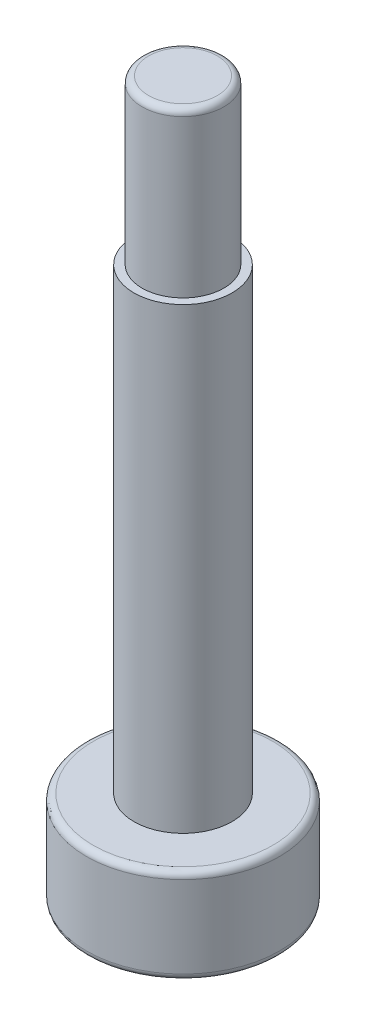
ISO-10303-21;
HEADER;
FILE_DESCRIPTION(('STEP AP214'),'2;1');
FILE_NAME('part.step','',(''),(''),'','','');
FILE_SCHEMA(('AUTOMOTIVE_DESIGN { 1 0 10303 214 1 1 1 1 }'));
ENDSEC;
DATA;
#1=APPLICATION_CONTEXT('core data for automotive mechanical design processes');
#2=APPLICATION_PROTOCOL_DEFINITION('international standard','automotive_design',2000,#1);
#3=PRODUCT_CONTEXT('',#1,'mechanical');
#4=PRODUCT('Part','Part','',(#3));
#5=PRODUCT_RELATED_PRODUCT_CATEGORY('part','',(#4));
#6=PRODUCT_DEFINITION_FORMATION('','',#4);
#7=PRODUCT_DEFINITION_CONTEXT('part definition',#1,'design');
#8=PRODUCT_DEFINITION('design','',#6,#7);
#9=PRODUCT_DEFINITION_SHAPE('','',#8);
#10=(LENGTH_UNIT() NAMED_UNIT(*) SI_UNIT(.MILLI.,.METRE.));
#11=(NAMED_UNIT(*) PLANE_ANGLE_UNIT() SI_UNIT($,.RADIAN.));
#12=(NAMED_UNIT(*) SI_UNIT($,.STERADIAN.) SOLID_ANGLE_UNIT());
#13=UNCERTAINTY_MEASURE_WITH_UNIT(LENGTH_MEASURE(1.E-05),#10,'distance_accuracy_value','');
#14=(GEOMETRIC_REPRESENTATION_CONTEXT(3) GLOBAL_UNCERTAINTY_ASSIGNED_CONTEXT((#13)) GLOBAL_UNIT_ASSIGNED_CONTEXT((#10,
#11,#12)) REPRESENTATION_CONTEXT('',''));
#15=CARTESIAN_POINT('',(0.,0.,0.));
#16=DIRECTION('',(0.,0.,1.));
#17=DIRECTION('',(1.,0.,0.));
#18=AXIS2_PLACEMENT_3D('',#15,#16,#17);
#19=CARTESIAN_POINT('',(0.,2.9,0.));
#20=DIRECTION('',(0.,-1.,0.));
#21=DIRECTION('',(0.,0.,-1.));
#22=AXIS2_PLACEMENT_3D('',#19,#20,#21);
#23=CYLINDRICAL_SURFACE('',#22,2.95);
#24=CARTESIAN_POINT('',(0.,0.2,0.));
#25=DIRECTION('',(0.,1.,0.));
#26=DIRECTION('',(0.,0.,1.));
#27=AXIS2_PLACEMENT_3D('',#24,#25,#26);
#28=CIRCLE('',#27,2.95);
#29=CARTESIAN_POINT('',(0.,0.2,2.95));
#30=VERTEX_POINT('',#29);
#31=EDGE_CURVE('E179',#30,#30,#28,.T.);
#32=ORIENTED_EDGE('',*,*,#31,.T.);
#33=EDGE_LOOP('',(#32));
#34=FACE_BOUND('',#33,.T.);
#35=CARTESIAN_POINT('',(0.,2.7,0.));
#36=DIRECTION('',(0.,1.,0.));
#37=DIRECTION('',(0.,0.,1.));
#38=AXIS2_PLACEMENT_3D('',#35,#36,#37);
#39=CIRCLE('',#38,2.95);
#40=CARTESIAN_POINT('',(0.,2.7,2.95));
#41=VERTEX_POINT('',#40);
#42=EDGE_CURVE('E168',#41,#41,#39,.F.);
#43=ORIENTED_EDGE('',*,*,#42,.T.);
#44=EDGE_LOOP('',(#43));
#45=FACE_BOUND('',#44,.T.);
#46=ADVANCED_FACE('F39',(#34,#45),#23,.T.);
#47=CARTESIAN_POINT('',(0.,2.9,0.));
#48=DIRECTION('',(0.,1.,0.));
#49=DIRECTION('',(0.,0.,1.));
#50=AXIS2_PLACEMENT_3D('',#47,#48,#49);
#51=PLANE('',#50);
#52=CARTESIAN_POINT('',(0.,2.9,0.));
#53=DIRECTION('',(0.,1.,0.));
#54=DIRECTION('',(0.,0.,1.));
#55=AXIS2_PLACEMENT_3D('',#52,#53,#54);
#56=CIRCLE('',#55,2.75);
#57=CARTESIAN_POINT('',(0.,2.9,2.75));
#58=VERTEX_POINT('',#57);
#59=EDGE_CURVE('E187',#58,#58,#56,.T.);
#60=ORIENTED_EDGE('',*,*,#59,.T.);
#61=EDGE_LOOP('',(#60));
#62=FACE_BOUND('',#61,.T.);
#63=CARTESIAN_POINT('',(0.,2.9,0.));
#64=DIRECTION('',(0.,1.,0.));
#65=DIRECTION('',(0.,0.,1.));
#66=AXIS2_PLACEMENT_3D('',#63,#64,#65);
#67=CIRCLE('',#66,1.5);
#68=CARTESIAN_POINT('',(0.,2.9,1.5));
#69=VERTEX_POINT('',#68);
#70=EDGE_CURVE('E169',#69,#69,#67,.T.);
#71=ORIENTED_EDGE('',*,*,#70,.F.);
#72=EDGE_LOOP('',(#71));
#73=FACE_BOUND('',#72,.T.);
#74=ADVANCED_FACE('F206',(#62,#73),#51,.T.);
#75=CARTESIAN_POINT('',(0.,0.,0.));
#76=DIRECTION('',(0.,1.,0.));
#77=DIRECTION('',(0.,0.,1.));
#78=AXIS2_PLACEMENT_3D('',#75,#76,#77);
#79=PLANE('',#78);
#80=CARTESIAN_POINT('',(0.,0.,0.));
#81=DIRECTION('',(0.,1.,0.));
#82=DIRECTION('',(0.,0.,1.));
#83=AXIS2_PLACEMENT_3D('',#80,#81,#82);
#84=CIRCLE('',#83,2.75);
#85=CARTESIAN_POINT('',(0.,0.,2.75));
#86=VERTEX_POINT('',#85);
#87=EDGE_CURVE('E183',#86,#86,#84,.F.);
#88=ORIENTED_EDGE('',*,*,#87,.T.);
#89=EDGE_LOOP('',(#88));
#90=FACE_BOUND('',#89,.T.);
#91=DIRECTION('',(-0.28704549437819,0.,0.95791695055322));
#92=VECTOR('',#91,1.);
#93=CARTESIAN_POINT('',(2.24728548800427,0.,-0.532016229770034));
#94=LINE('',#93,#92);
#95=CARTESIAN_POINT('',(2.24728548800427,0.,-0.532016229770034));
#96=VERTEX_POINT('',#95);
#97=CARTESIAN_POINT('',(1.58438231420861,0.,1.68019820728279));
#98=VERTEX_POINT('',#97);
#99=EDGE_CURVE('E135',#96,#98,#94,.T.);
#100=ORIENTED_EDGE('',*,*,#99,.F.);
#101=DIRECTION('',(0.686057666705715,0.,0.727547165449986));
#102=VECTOR('',#101,1.);
#103=CARTESIAN_POINT('',(0.662903173795668,0.,-2.21221443705283));
#104=LINE('',#103,#102);
#105=CARTESIAN_POINT('',(0.662903173795668,0.,-2.21221443705283));
#106=VERTEX_POINT('',#105);
#107=EDGE_CURVE('E55',#106,#96,#104,.T.);
#108=ORIENTED_EDGE('',*,*,#107,.F.);
#109=DIRECTION('',(0.973103161083906,0.,-0.230369785103234));
#110=VECTOR('',#109,1.);
#111=CARTESIAN_POINT('',(-1.58438231420861,0.,-1.68019820728279));
#112=LINE('',#111,#110);
#113=CARTESIAN_POINT('',(-1.58438231420861,0.,-1.68019820728279));
#114=VERTEX_POINT('',#113);
#115=EDGE_CURVE('E148',#114,#106,#112,.T.);
#116=ORIENTED_EDGE('',*,*,#115,.F.);
#117=DIRECTION('',(0.28704549437819,0.,-0.95791695055322));
#118=VECTOR('',#117,1.);
#119=CARTESIAN_POINT('',(-2.24728548800427,0.,0.532016229770034));
#120=LINE('',#119,#118);
#121=CARTESIAN_POINT('',(-2.24728548800427,0.,0.532016229770034));
#122=VERTEX_POINT('',#121);
#123=EDGE_CURVE('E145',#122,#114,#120,.T.);
#124=ORIENTED_EDGE('',*,*,#123,.F.);
#125=DIRECTION('',(-0.686057666705716,0.,-0.727547165449986));
#126=VECTOR('',#125,1.);
#127=CARTESIAN_POINT('',(-0.662903173795669,0.,2.21221443705283));
#128=LINE('',#127,#126);
#129=CARTESIAN_POINT('',(-0.662903173795669,0.,2.21221443705283));
#130=VERTEX_POINT('',#129);
#131=EDGE_CURVE('E103',#130,#122,#128,.T.);
#132=ORIENTED_EDGE('',*,*,#131,.F.);
#133=DIRECTION('',(-0.973103161083906,0.,0.230369785103234));
#134=VECTOR('',#133,1.);
#135=CARTESIAN_POINT('',(1.58438231420861,0.,1.68019820728279));
#136=LINE('',#135,#134);
#137=EDGE_CURVE('E139',#98,#130,#136,.T.);
#138=ORIENTED_EDGE('',*,*,#137,.F.);
#139=EDGE_LOOP('',(#100,#108,#116,#124,#132,#138));
#140=FACE_BOUND('',#139,.T.);
#141=ADVANCED_FACE('F212',(#90,#140),#79,.F.);
#142=CARTESIAN_POINT('',(0.,16.9,0.));
#143=DIRECTION('',(0.,-1.,0.));
#144=DIRECTION('',(0.,0.,-1.));
#145=AXIS2_PLACEMENT_3D('',#142,#143,#144);
#146=CYLINDRICAL_SURFACE('',#145,1.5);
#147=CARTESIAN_POINT('',(0.,16.9,0.));
#148=DIRECTION('',(0.,1.,0.));
#149=DIRECTION('',(0.,0.,1.));
#150=AXIS2_PLACEMENT_3D('',#147,#148,#149);
#151=CIRCLE('',#150,1.5);
#152=CARTESIAN_POINT('',(0.,16.9,1.5));
#153=VERTEX_POINT('',#152);
#154=EDGE_CURVE('E154',#153,#153,#151,.T.);
#155=ORIENTED_EDGE('',*,*,#154,.F.);
#156=EDGE_LOOP('',(#155));
#157=FACE_BOUND('',#156,.T.);
#158=ORIENTED_EDGE('',*,*,#70,.T.);
#159=EDGE_LOOP('',(#158));
#160=FACE_BOUND('',#159,.T.);
#161=ADVANCED_FACE('F231',(#157,#160),#146,.T.);
#162=CARTESIAN_POINT('',(0.,16.9,0.));
#163=DIRECTION('',(0.,1.,0.));
#164=DIRECTION('',(0.,0.,1.));
#165=AXIS2_PLACEMENT_3D('',#162,#163,#164);
#166=PLANE('',#165);
#167=CARTESIAN_POINT('',(0.,16.9,0.));
#168=DIRECTION('',(0.,1.,0.));
#169=DIRECTION('',(0.,0.,1.));
#170=AXIS2_PLACEMENT_3D('',#167,#168,#169);
#171=CIRCLE('',#170,1.25);
#172=CARTESIAN_POINT('',(0.,16.9,1.25));
#173=VERTEX_POINT('',#172);
#174=EDGE_CURVE('E164',#173,#173,#171,.T.);
#175=ORIENTED_EDGE('',*,*,#174,.F.);
#176=EDGE_LOOP('',(#175));
#177=FACE_BOUND('',#176,.T.);
#178=ORIENTED_EDGE('',*,*,#154,.T.);
#179=EDGE_LOOP('',(#178));
#180=FACE_BOUND('',#179,.T.);
#181=ADVANCED_FACE('F255',(#177,#180),#166,.T.);
#182=CARTESIAN_POINT('',(0.,21.9,0.));
#183=DIRECTION('',(0.,-1.,0.));
#184=DIRECTION('',(0.,0.,-1.));
#185=AXIS2_PLACEMENT_3D('',#182,#183,#184);
#186=CYLINDRICAL_SURFACE('',#185,1.25);
#187=CARTESIAN_POINT('',(0.,21.7,0.));
#188=DIRECTION('',(0.,1.,0.));
#189=DIRECTION('',(0.,0.,1.));
#190=AXIS2_PLACEMENT_3D('',#187,#188,#189);
#191=CIRCLE('',#190,1.25);
#192=CARTESIAN_POINT('',(0.,21.7,1.25));
#193=VERTEX_POINT('',#192);
#194=EDGE_CURVE('E11',#193,#193,#191,.F.);
#195=ORIENTED_EDGE('',*,*,#194,.T.);
#196=EDGE_LOOP('',(#195));
#197=FACE_BOUND('',#196,.T.);
#198=ORIENTED_EDGE('',*,*,#174,.T.);
#199=EDGE_LOOP('',(#198));
#200=FACE_BOUND('',#199,.T.);
#201=ADVANCED_FACE('F248',(#197,#200),#186,.T.);
#202=CARTESIAN_POINT('',(0.,21.9,0.));
#203=DIRECTION('',(0.,1.,0.));
#204=DIRECTION('',(0.,0.,1.));
#205=AXIS2_PLACEMENT_3D('',#202,#203,#204);
#206=PLANE('',#205);
#207=CARTESIAN_POINT('',(0.,21.9,0.));
#208=DIRECTION('',(0.,1.,0.));
#209=DIRECTION('',(0.,0.,1.));
#210=AXIS2_PLACEMENT_3D('',#207,#208,#209);
#211=CIRCLE('',#210,1.05);
#212=CARTESIAN_POINT('',(0.,21.9,1.05));
#213=VERTEX_POINT('',#212);
#214=EDGE_CURVE('E48',#213,#213,#211,.T.);
#215=ORIENTED_EDGE('',*,*,#214,.T.);
#216=EDGE_LOOP('',(#215));
#217=FACE_BOUND('',#216,.T.);
#218=ADVANCED_FACE('F194',(#217),#206,.T.);
#219=CARTESIAN_POINT('',(0.662903173795668,2.,-2.21221443705283));
#220=DIRECTION('',(0.727547165449986,0.,-0.686057666705715));
#221=DIRECTION('',(-0.686057666705716,0.,-0.727547165449986));
#222=AXIS2_PLACEMENT_3D('',#219,#220,#221);
#223=PLANE('',#222);
#224=ORIENTED_EDGE('',*,*,#107,.T.);
#225=DIRECTION('',(0.,-1.,0.));
#226=VECTOR('',#225,1.);
#227=CARTESIAN_POINT('',(2.24728548800427,2.,-0.532016229770034));
#228=LINE('',#227,#226);
#229=CARTESIAN_POINT('',(2.24728548800427,2.,-0.532016229770034));
#230=VERTEX_POINT('',#229);
#231=EDGE_CURVE('E85',#230,#96,#228,.T.);
#232=ORIENTED_EDGE('',*,*,#231,.F.);
#233=DIRECTION('',(0.686057666705715,0.,0.727547165449986));
#234=VECTOR('',#233,1.);
#235=CARTESIAN_POINT('',(0.662903173795668,2.,-2.21221443705283));
#236=LINE('',#235,#234);
#237=CARTESIAN_POINT('',(0.662903173795668,2.,-2.21221443705283));
#238=VERTEX_POINT('',#237);
#239=EDGE_CURVE('E151',#238,#230,#236,.T.);
#240=ORIENTED_EDGE('',*,*,#239,.F.);
#241=DIRECTION('',(0.,-1.,0.));
#242=VECTOR('',#241,1.);
#243=CARTESIAN_POINT('',(0.662903173795668,2.,-2.21221443705283));
#244=LINE('',#243,#242);
#245=EDGE_CURVE('E63',#238,#106,#244,.T.);
#246=ORIENTED_EDGE('',*,*,#245,.T.);
#247=EDGE_LOOP('',(#224,#232,#240,#246));
#248=FACE_BOUND('',#247,.T.);
#249=ADVANCED_FACE('F239',(#248),#223,.F.);
#250=CARTESIAN_POINT('',(-1.58438231420861,2.,-1.68019820728279));
#251=DIRECTION('',(-0.230369785103234,0.,-0.973103161083906));
#252=DIRECTION('',(-0.973103161083906,0.,0.230369785103234));
#253=AXIS2_PLACEMENT_3D('',#250,#251,#252);
#254=PLANE('',#253);
#255=ORIENTED_EDGE('',*,*,#115,.T.);
#256=ORIENTED_EDGE('',*,*,#245,.F.);
#257=DIRECTION('',(0.973103161083906,0.,-0.230369785103234));
#258=VECTOR('',#257,1.);
#259=CARTESIAN_POINT('',(-1.58438231420861,2.,-1.68019820728279));
#260=LINE('',#259,#258);
#261=CARTESIAN_POINT('',(-1.58438231420861,2.,-1.68019820728279));
#262=VERTEX_POINT('',#261);
#263=EDGE_CURVE('E117',#262,#238,#260,.T.);
#264=ORIENTED_EDGE('',*,*,#263,.F.);
#265=DIRECTION('',(0.,-1.,0.));
#266=VECTOR('',#265,1.);
#267=CARTESIAN_POINT('',(-1.58438231420861,2.,-1.68019820728279));
#268=LINE('',#267,#266);
#269=EDGE_CURVE('E108',#262,#114,#268,.T.);
#270=ORIENTED_EDGE('',*,*,#269,.T.);
#271=EDGE_LOOP('',(#255,#256,#264,#270));
#272=FACE_BOUND('',#271,.T.);
#273=ADVANCED_FACE('F241',(#272),#254,.F.);
#274=CARTESIAN_POINT('',(-2.24728548800427,2.,0.532016229770034));
#275=DIRECTION('',(-0.95791695055322,0.,-0.28704549437819));
#276=DIRECTION('',(-0.28704549437819,0.,0.95791695055322));
#277=AXIS2_PLACEMENT_3D('',#274,#275,#276);
#278=PLANE('',#277);
#279=ORIENTED_EDGE('',*,*,#123,.T.);
#280=ORIENTED_EDGE('',*,*,#269,.F.);
#281=DIRECTION('',(0.28704549437819,0.,-0.95791695055322));
#282=VECTOR('',#281,1.);
#283=CARTESIAN_POINT('',(-2.24728548800427,2.,0.532016229770034));
#284=LINE('',#283,#282);
#285=CARTESIAN_POINT('',(-2.24728548800427,2.,0.532016229770034));
#286=VERTEX_POINT('',#285);
#287=EDGE_CURVE('E112',#286,#262,#284,.T.);
#288=ORIENTED_EDGE('',*,*,#287,.F.);
#289=DIRECTION('',(0.,-1.,0.));
#290=VECTOR('',#289,1.);
#291=CARTESIAN_POINT('',(-2.24728548800427,2.,0.532016229770034));
#292=LINE('',#291,#290);
#293=EDGE_CURVE('E96',#286,#122,#292,.T.);
#294=ORIENTED_EDGE('',*,*,#293,.T.);
#295=EDGE_LOOP('',(#279,#280,#288,#294));
#296=FACE_BOUND('',#295,.T.);
#297=ADVANCED_FACE('F113',(#296),#278,.F.);
#298=CARTESIAN_POINT('',(-0.662903173795669,2.,2.21221443705283));
#299=DIRECTION('',(-0.727547165449986,0.,0.686057666705716));
#300=DIRECTION('',(0.686057666705716,0.,0.727547165449986));
#301=AXIS2_PLACEMENT_3D('',#298,#299,#300);
#302=PLANE('',#301);
#303=ORIENTED_EDGE('',*,*,#131,.T.);
#304=ORIENTED_EDGE('',*,*,#293,.F.);
#305=DIRECTION('',(-0.686057666705716,0.,-0.727547165449986));
#306=VECTOR('',#305,1.);
#307=CARTESIAN_POINT('',(-0.662903173795669,2.,2.21221443705283));
#308=LINE('',#307,#306);
#309=CARTESIAN_POINT('',(-0.662903173795669,2.,2.21221443705283));
#310=VERTEX_POINT('',#309);
#311=EDGE_CURVE('E100',#310,#286,#308,.T.);
#312=ORIENTED_EDGE('',*,*,#311,.F.);
#313=DIRECTION('',(0.,-1.,0.));
#314=VECTOR('',#313,1.);
#315=CARTESIAN_POINT('',(-0.662903173795669,2.,2.21221443705283));
#316=LINE('',#315,#314);
#317=EDGE_CURVE('E109',#310,#130,#316,.T.);
#318=ORIENTED_EDGE('',*,*,#317,.T.);
#319=EDGE_LOOP('',(#303,#304,#312,#318));
#320=FACE_BOUND('',#319,.T.);
#321=ADVANCED_FACE('F98',(#320),#302,.F.);
#322=CARTESIAN_POINT('',(1.58438231420861,2.,1.68019820728279));
#323=DIRECTION('',(0.230369785103234,0.,0.973103161083906));
#324=DIRECTION('',(0.973103161083906,0.,-0.230369785103234));
#325=AXIS2_PLACEMENT_3D('',#322,#323,#324);
#326=PLANE('',#325);
#327=ORIENTED_EDGE('',*,*,#137,.T.);
#328=ORIENTED_EDGE('',*,*,#317,.F.);
#329=DIRECTION('',(-0.973103161083906,0.,0.230369785103234));
#330=VECTOR('',#329,1.);
#331=CARTESIAN_POINT('',(1.58438231420861,2.,1.68019820728279));
#332=LINE('',#331,#330);
#333=CARTESIAN_POINT('',(1.58438231420861,2.,1.68019820728279));
#334=VERTEX_POINT('',#333);
#335=EDGE_CURVE('E123',#334,#310,#332,.T.);
#336=ORIENTED_EDGE('',*,*,#335,.F.);
#337=DIRECTION('',(0.,-1.,0.));
#338=VECTOR('',#337,1.);
#339=CARTESIAN_POINT('',(1.58438231420861,2.,1.68019820728279));
#340=LINE('',#339,#338);
#341=EDGE_CURVE('E159',#334,#98,#340,.T.);
#342=ORIENTED_EDGE('',*,*,#341,.T.);
#343=EDGE_LOOP('',(#327,#328,#336,#342));
#344=FACE_BOUND('',#343,.T.);
#345=ADVANCED_FACE('F313',(#344),#326,.F.);
#346=CARTESIAN_POINT('',(2.24728548800427,2.,-0.532016229770034));
#347=DIRECTION('',(0.95791695055322,0.,0.28704549437819));
#348=DIRECTION('',(0.28704549437819,0.,-0.95791695055322));
#349=AXIS2_PLACEMENT_3D('',#346,#347,#348);
#350=PLANE('',#349);
#351=ORIENTED_EDGE('',*,*,#99,.T.);
#352=ORIENTED_EDGE('',*,*,#341,.F.);
#353=DIRECTION('',(-0.28704549437819,0.,0.95791695055322));
#354=VECTOR('',#353,1.);
#355=CARTESIAN_POINT('',(2.24728548800427,2.,-0.532016229770034));
#356=LINE('',#355,#354);
#357=EDGE_CURVE('E127',#230,#334,#356,.T.);
#358=ORIENTED_EDGE('',*,*,#357,.F.);
#359=ORIENTED_EDGE('',*,*,#231,.T.);
#360=EDGE_LOOP('',(#351,#352,#358,#359));
#361=FACE_BOUND('',#360,.T.);
#362=ADVANCED_FACE('F223',(#361),#350,.F.);
#363=CARTESIAN_POINT('',(0.,2.,0.));
#364=DIRECTION('',(0.,-1.,0.));
#365=DIRECTION('',(0.,0.,-1.));
#366=AXIS2_PLACEMENT_3D('',#363,#364,#365);
#367=PLANE('',#366);
#368=ORIENTED_EDGE('',*,*,#239,.T.);
#369=ORIENTED_EDGE('',*,*,#357,.T.);
#370=ORIENTED_EDGE('',*,*,#335,.T.);
#371=ORIENTED_EDGE('',*,*,#311,.T.);
#372=ORIENTED_EDGE('',*,*,#287,.T.);
#373=ORIENTED_EDGE('',*,*,#263,.T.);
#374=EDGE_LOOP('',(#368,#369,#370,#371,#372,#373));
#375=FACE_BOUND('',#374,.T.);
#376=ADVANCED_FACE('F120',(#375),#367,.T.);
#377=CARTESIAN_POINT('',(0.,0.2,0.));
#378=DIRECTION('',(0.,1.,0.));
#379=DIRECTION('',(0.,0.,1.));
#380=AXIS2_PLACEMENT_3D('',#377,#378,#379);
#381=TOROIDAL_SURFACE('',#380,2.75,0.2);
#382=ORIENTED_EDGE('',*,*,#87,.F.);
#383=EDGE_LOOP('',(#382));
#384=FACE_BOUND('',#383,.T.);
#385=ORIENTED_EDGE('',*,*,#31,.F.);
#386=EDGE_LOOP('',(#385));
#387=FACE_BOUND('',#386,.T.);
#388=ADVANCED_FACE('F202',(#384,#387),#381,.T.);
#389=CARTESIAN_POINT('',(0.,2.7,0.));
#390=DIRECTION('',(0.,1.,0.));
#391=DIRECTION('',(0.,0.,1.));
#392=AXIS2_PLACEMENT_3D('',#389,#390,#391);
#393=TOROIDAL_SURFACE('',#392,2.75,0.2);
#394=ORIENTED_EDGE('',*,*,#42,.F.);
#395=EDGE_LOOP('',(#394));
#396=FACE_BOUND('',#395,.T.);
#397=ORIENTED_EDGE('',*,*,#59,.F.);
#398=EDGE_LOOP('',(#397));
#399=FACE_BOUND('',#398,.T.);
#400=ADVANCED_FACE('F197',(#396,#399),#393,.T.);
#401=CARTESIAN_POINT('',(0.,21.7,0.));
#402=DIRECTION('',(0.,1.,0.));
#403=DIRECTION('',(0.,0.,1.));
#404=AXIS2_PLACEMENT_3D('',#401,#402,#403);
#405=TOROIDAL_SURFACE('',#404,1.05,0.2);
#406=ORIENTED_EDGE('',*,*,#194,.F.);
#407=EDGE_LOOP('',(#406));
#408=FACE_BOUND('',#407,.T.);
#409=ORIENTED_EDGE('',*,*,#214,.F.);
#410=EDGE_LOOP('',(#409));
#411=FACE_BOUND('',#410,.T.);
#412=ADVANCED_FACE('F41',(#408,#411),#405,.T.);
#413=CLOSED_SHELL('',(#46,#74,#141,#161,#181,#201,#218,#249,#273,#297,#321,#345,#362,#376,#388,
#400,#412));
#414=MANIFOLD_SOLID_BREP('B2',#413);
#415=ADVANCED_BREP_SHAPE_REPRESENTATION('',(#18,#414),#14);
#416=SHAPE_DEFINITION_REPRESENTATION(#9,#415);
ENDSEC;
END-ISO-10303-21;
